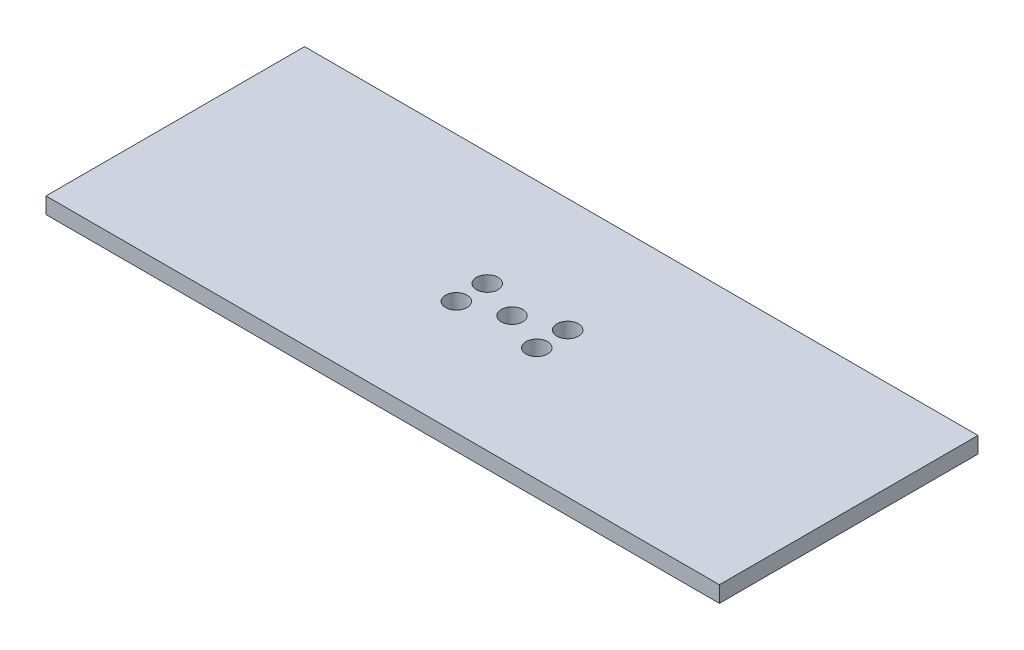
ISO-10303-21;
HEADER;
FILE_DESCRIPTION(('STEP AP214'),'2;1');
FILE_NAME('part.step','',(''),(''),'','','');
FILE_SCHEMA(('AUTOMOTIVE_DESIGN { 1 0 10303 214 1 1 1 1 }'));
ENDSEC;
DATA;
#1=APPLICATION_CONTEXT('core data for automotive mechanical design processes');
#2=APPLICATION_PROTOCOL_DEFINITION('international standard','automotive_design',2000,#1);
#3=PRODUCT_CONTEXT('',#1,'mechanical');
#4=PRODUCT('Part','Part','',(#3));
#5=PRODUCT_RELATED_PRODUCT_CATEGORY('part','',(#4));
#6=PRODUCT_DEFINITION_FORMATION('','',#4);
#7=PRODUCT_DEFINITION_CONTEXT('part definition',#1,'design');
#8=PRODUCT_DEFINITION('design','',#6,#7);
#9=PRODUCT_DEFINITION_SHAPE('','',#8);
#10=(LENGTH_UNIT() NAMED_UNIT(*) SI_UNIT(.MILLI.,.METRE.));
#11=(NAMED_UNIT(*) PLANE_ANGLE_UNIT() SI_UNIT($,.RADIAN.));
#12=(NAMED_UNIT(*) SI_UNIT($,.STERADIAN.) SOLID_ANGLE_UNIT());
#13=UNCERTAINTY_MEASURE_WITH_UNIT(LENGTH_MEASURE(1.E-05),#10,'distance_accuracy_value','');
#14=(GEOMETRIC_REPRESENTATION_CONTEXT(3) GLOBAL_UNCERTAINTY_ASSIGNED_CONTEXT((#13)) GLOBAL_UNIT_ASSIGNED_CONTEXT((#10,
#11,#12)) REPRESENTATION_CONTEXT('',''));
#15=CARTESIAN_POINT('',(0.,0.,0.));
#16=DIRECTION('',(0.,0.,1.));
#17=DIRECTION('',(1.,0.,0.));
#18=AXIS2_PLACEMENT_3D('',#15,#16,#17);
#19=CARTESIAN_POINT('',(0.,3.,0.));
#20=DIRECTION('',(0.,-1.,0.));
#21=DIRECTION('',(0.,0.,-1.));
#22=AXIS2_PLACEMENT_3D('',#19,#20,#21);
#23=PLANE('',#22);
#24=DIRECTION('',(0.,0.,-1.));
#25=VECTOR('',#24,1.);
#26=CARTESIAN_POINT('',(62.5,3.,24.));
#27=LINE('',#26,#25);
#28=CARTESIAN_POINT('',(62.5,3.,24.));
#29=VERTEX_POINT('',#28);
#30=CARTESIAN_POINT('',(62.5,3.,-24.));
#31=VERTEX_POINT('',#30);
#32=EDGE_CURVE('E92',#29,#31,#27,.T.);
#33=ORIENTED_EDGE('',*,*,#32,.T.);
#34=DIRECTION('',(-1.,0.,0.));
#35=VECTOR('',#34,1.);
#36=CARTESIAN_POINT('',(-62.5,3.,-24.));
#37=LINE('',#36,#35);
#38=CARTESIAN_POINT('',(-62.5,3.,-24.));
#39=VERTEX_POINT('',#38);
#40=EDGE_CURVE('E87',#31,#39,#37,.T.);
#41=ORIENTED_EDGE('',*,*,#40,.T.);
#42=DIRECTION('',(0.,0.,1.));
#43=VECTOR('',#42,1.);
#44=CARTESIAN_POINT('',(-62.5,3.,24.));
#45=LINE('',#44,#43);
#46=CARTESIAN_POINT('',(-62.5,3.,24.));
#47=VERTEX_POINT('',#46);
#48=EDGE_CURVE('E90',#39,#47,#45,.T.);
#49=ORIENTED_EDGE('',*,*,#48,.T.);
#50=DIRECTION('',(1.,0.,0.));
#51=VECTOR('',#50,1.);
#52=CARTESIAN_POINT('',(-62.5,3.,24.));
#53=LINE('',#52,#51);
#54=EDGE_CURVE('E57',#47,#29,#53,.T.);
#55=ORIENTED_EDGE('',*,*,#54,.T.);
#56=EDGE_LOOP('',(#33,#41,#49,#55));
#57=FACE_BOUND('',#56,.T.);
#58=CARTESIAN_POINT('',(0.,3.,0.));
#59=DIRECTION('',(0.,1.,0.));
#60=DIRECTION('',(0.,0.,1.));
#61=AXIS2_PLACEMENT_3D('',#58,#59,#60);
#62=CIRCLE('',#61,2.);
#63=CARTESIAN_POINT('',(0.,3.,2.));
#64=VERTEX_POINT('',#63);
#65=EDGE_CURVE('E112',#64,#64,#62,.T.);
#66=ORIENTED_EDGE('',*,*,#65,.F.);
#67=EDGE_LOOP('',(#66));
#68=FACE_BOUND('',#67,.T.);
#69=CARTESIAN_POINT('',(-7.4683036326853,3.,-2.86782859495116));
#70=DIRECTION('',(0.,1.,0.));
#71=DIRECTION('',(0.,0.,1.));
#72=AXIS2_PLACEMENT_3D('',#69,#70,#71);
#73=CIRCLE('',#72,2.);
#74=CARTESIAN_POINT('',(-7.4683036326853,3.,-0.867828594951156));
#75=VERTEX_POINT('',#74);
#76=EDGE_CURVE('E134',#75,#75,#73,.T.);
#77=ORIENTED_EDGE('',*,*,#76,.F.);
#78=EDGE_LOOP('',(#77));
#79=FACE_BOUND('',#78,.T.);
#80=CARTESIAN_POINT('',(7.4683036326853,3.,2.86782859495116));
#81=DIRECTION('',(0.,1.,0.));
#82=DIRECTION('',(0.,0.,1.));
#83=AXIS2_PLACEMENT_3D('',#80,#81,#82);
#84=CIRCLE('',#83,2.);
#85=CARTESIAN_POINT('',(7.4683036326853,3.,4.86782859495116));
#86=VERTEX_POINT('',#85);
#87=EDGE_CURVE('E142',#86,#86,#84,.T.);
#88=ORIENTED_EDGE('',*,*,#87,.F.);
#89=EDGE_LOOP('',(#88));
#90=FACE_BOUND('',#89,.T.);
#91=CARTESIAN_POINT('',(-7.4683036326853,3.,2.86782859495116));
#92=DIRECTION('',(0.,1.,0.));
#93=DIRECTION('',(0.,0.,1.));
#94=AXIS2_PLACEMENT_3D('',#91,#92,#93);
#95=CIRCLE('',#94,2.);
#96=CARTESIAN_POINT('',(-7.4683036326853,3.,4.86782859495116));
#97=VERTEX_POINT('',#96);
#98=EDGE_CURVE('E150',#97,#97,#95,.T.);
#99=ORIENTED_EDGE('',*,*,#98,.F.);
#100=EDGE_LOOP('',(#99));
#101=FACE_BOUND('',#100,.T.);
#102=CARTESIAN_POINT('',(7.4683036326853,3.,-2.86782859495116));
#103=DIRECTION('',(0.,1.,0.));
#104=DIRECTION('',(0.,0.,1.));
#105=AXIS2_PLACEMENT_3D('',#102,#103,#104);
#106=CIRCLE('',#105,2.);
#107=CARTESIAN_POINT('',(7.4683036326853,3.,-0.867828594951153));
#108=VERTEX_POINT('',#107);
#109=EDGE_CURVE('E158',#108,#108,#106,.T.);
#110=ORIENTED_EDGE('',*,*,#109,.F.);
#111=EDGE_LOOP('',(#110));
#112=FACE_BOUND('',#111,.T.);
#113=ADVANCED_FACE('F39',(#57,#68,#79,#90,#101,#112),#23,.F.);
#114=CARTESIAN_POINT('',(0.,0.,0.));
#115=DIRECTION('',(0.,-1.,0.));
#116=DIRECTION('',(0.,0.,-1.));
#117=AXIS2_PLACEMENT_3D('',#114,#115,#116);
#118=PLANE('',#117);
#119=CARTESIAN_POINT('',(-7.4683036326853,0.,2.86782859495116));
#120=DIRECTION('',(0.,1.,0.));
#121=DIRECTION('',(0.,0.,1.));
#122=AXIS2_PLACEMENT_3D('',#119,#120,#121);
#123=CIRCLE('',#122,2.);
#124=CARTESIAN_POINT('',(-7.4683036326853,0.,4.86782859495116));
#125=VERTEX_POINT('',#124);
#126=EDGE_CURVE('E154',#125,#125,#123,.T.);
#127=ORIENTED_EDGE('',*,*,#126,.T.);
#128=EDGE_LOOP('',(#127));
#129=FACE_BOUND('',#128,.T.);
#130=CARTESIAN_POINT('',(-7.4683036326853,0.,-2.86782859495116));
#131=DIRECTION('',(0.,1.,0.));
#132=DIRECTION('',(0.,0.,1.));
#133=AXIS2_PLACEMENT_3D('',#130,#131,#132);
#134=CIRCLE('',#133,2.);
#135=CARTESIAN_POINT('',(-7.4683036326853,0.,-0.867828594951156));
#136=VERTEX_POINT('',#135);
#137=EDGE_CURVE('E138',#136,#136,#134,.T.);
#138=ORIENTED_EDGE('',*,*,#137,.T.);
#139=EDGE_LOOP('',(#138));
#140=FACE_BOUND('',#139,.T.);
#141=DIRECTION('',(0.,0.,-1.));
#142=VECTOR('',#141,1.);
#143=CARTESIAN_POINT('',(62.5,0.,24.));
#144=LINE('',#143,#142);
#145=CARTESIAN_POINT('',(62.5,0.,24.));
#146=VERTEX_POINT('',#145);
#147=CARTESIAN_POINT('',(62.5,0.,-24.));
#148=VERTEX_POINT('',#147);
#149=EDGE_CURVE('E108',#146,#148,#144,.T.);
#150=ORIENTED_EDGE('',*,*,#149,.F.);
#151=DIRECTION('',(1.,0.,0.));
#152=VECTOR('',#151,1.);
#153=CARTESIAN_POINT('',(-62.5,0.,24.));
#154=LINE('',#153,#152);
#155=CARTESIAN_POINT('',(-62.5,0.,24.));
#156=VERTEX_POINT('',#155);
#157=EDGE_CURVE('E80',#156,#146,#154,.T.);
#158=ORIENTED_EDGE('',*,*,#157,.F.);
#159=DIRECTION('',(0.,0.,1.));
#160=VECTOR('',#159,1.);
#161=CARTESIAN_POINT('',(-62.5,0.,24.));
#162=LINE('',#161,#160);
#163=CARTESIAN_POINT('',(-62.5,0.,-24.));
#164=VERTEX_POINT('',#163);
#165=EDGE_CURVE('E74',#164,#156,#162,.T.);
#166=ORIENTED_EDGE('',*,*,#165,.F.);
#167=DIRECTION('',(-1.,0.,0.));
#168=VECTOR('',#167,1.);
#169=CARTESIAN_POINT('',(-62.5,0.,-24.));
#170=LINE('',#169,#168);
#171=EDGE_CURVE('E97',#148,#164,#170,.T.);
#172=ORIENTED_EDGE('',*,*,#171,.F.);
#173=EDGE_LOOP('',(#150,#158,#166,#172));
#174=FACE_BOUND('',#173,.T.);
#175=CARTESIAN_POINT('',(0.,0.,0.));
#176=DIRECTION('',(0.,1.,0.));
#177=DIRECTION('',(0.,0.,1.));
#178=AXIS2_PLACEMENT_3D('',#175,#176,#177);
#179=CIRCLE('',#178,2.);
#180=CARTESIAN_POINT('',(0.,0.,2.));
#181=VERTEX_POINT('',#180);
#182=EDGE_CURVE('E130',#181,#181,#179,.T.);
#183=ORIENTED_EDGE('',*,*,#182,.T.);
#184=EDGE_LOOP('',(#183));
#185=FACE_BOUND('',#184,.T.);
#186=CARTESIAN_POINT('',(7.4683036326853,0.,2.86782859495116));
#187=DIRECTION('',(0.,1.,0.));
#188=DIRECTION('',(0.,0.,1.));
#189=AXIS2_PLACEMENT_3D('',#186,#187,#188);
#190=CIRCLE('',#189,2.);
#191=CARTESIAN_POINT('',(7.4683036326853,0.,4.86782859495116));
#192=VERTEX_POINT('',#191);
#193=EDGE_CURVE('E146',#192,#192,#190,.T.);
#194=ORIENTED_EDGE('',*,*,#193,.T.);
#195=EDGE_LOOP('',(#194));
#196=FACE_BOUND('',#195,.T.);
#197=CARTESIAN_POINT('',(7.4683036326853,0.,-2.86782859495116));
#198=DIRECTION('',(0.,1.,0.));
#199=DIRECTION('',(0.,0.,1.));
#200=AXIS2_PLACEMENT_3D('',#197,#198,#199);
#201=CIRCLE('',#200,2.);
#202=CARTESIAN_POINT('',(7.4683036326853,0.,-0.867828594951153));
#203=VERTEX_POINT('',#202);
#204=EDGE_CURVE('E162',#203,#203,#201,.T.);
#205=ORIENTED_EDGE('',*,*,#204,.T.);
#206=EDGE_LOOP('',(#205));
#207=FACE_BOUND('',#206,.T.);
#208=ADVANCED_FACE('F125',(#129,#140,#174,#185,#196,#207),#118,.T.);
#209=CARTESIAN_POINT('',(62.5,3.,24.));
#210=DIRECTION('',(-1.,0.,0.));
#211=DIRECTION('',(0.,0.,1.));
#212=AXIS2_PLACEMENT_3D('',#209,#210,#211);
#213=PLANE('',#212);
#214=ORIENTED_EDGE('',*,*,#149,.T.);
#215=DIRECTION('',(0.,-1.,0.));
#216=VECTOR('',#215,1.);
#217=CARTESIAN_POINT('',(62.5,3.,-24.));
#218=LINE('',#217,#216);
#219=EDGE_CURVE('E11',#31,#148,#218,.T.);
#220=ORIENTED_EDGE('',*,*,#219,.F.);
#221=ORIENTED_EDGE('',*,*,#32,.F.);
#222=DIRECTION('',(0.,-1.,0.));
#223=VECTOR('',#222,1.);
#224=CARTESIAN_POINT('',(62.5,3.,24.));
#225=LINE('',#224,#223);
#226=EDGE_CURVE('E104',#29,#146,#225,.T.);
#227=ORIENTED_EDGE('',*,*,#226,.T.);
#228=EDGE_LOOP('',(#214,#220,#221,#227));
#229=FACE_BOUND('',#228,.T.);
#230=ADVANCED_FACE('F41',(#229),#213,.F.);
#231=CARTESIAN_POINT('',(-62.5,3.,-24.));
#232=DIRECTION('',(0.,0.,1.));
#233=DIRECTION('',(1.,0.,0.));
#234=AXIS2_PLACEMENT_3D('',#231,#232,#233);
#235=PLANE('',#234);
#236=ORIENTED_EDGE('',*,*,#171,.T.);
#237=DIRECTION('',(0.,-1.,0.));
#238=VECTOR('',#237,1.);
#239=CARTESIAN_POINT('',(-62.5,3.,-24.));
#240=LINE('',#239,#238);
#241=EDGE_CURVE('E49',#39,#164,#240,.T.);
#242=ORIENTED_EDGE('',*,*,#241,.F.);
#243=ORIENTED_EDGE('',*,*,#40,.F.);
#244=ORIENTED_EDGE('',*,*,#219,.T.);
#245=EDGE_LOOP('',(#236,#242,#243,#244));
#246=FACE_BOUND('',#245,.T.);
#247=ADVANCED_FACE('F96',(#246),#235,.F.);
#248=CARTESIAN_POINT('',(-62.5,3.,24.));
#249=DIRECTION('',(1.,0.,0.));
#250=DIRECTION('',(0.,0.,-1.));
#251=AXIS2_PLACEMENT_3D('',#248,#249,#250);
#252=PLANE('',#251);
#253=ORIENTED_EDGE('',*,*,#165,.T.);
#254=DIRECTION('',(0.,-1.,0.));
#255=VECTOR('',#254,1.);
#256=CARTESIAN_POINT('',(-62.5,3.,24.));
#257=LINE('',#256,#255);
#258=EDGE_CURVE('E99',#47,#156,#257,.T.);
#259=ORIENTED_EDGE('',*,*,#258,.F.);
#260=ORIENTED_EDGE('',*,*,#48,.F.);
#261=ORIENTED_EDGE('',*,*,#241,.T.);
#262=EDGE_LOOP('',(#253,#259,#260,#261));
#263=FACE_BOUND('',#262,.T.);
#264=ADVANCED_FACE('F100',(#263),#252,.F.);
#265=CARTESIAN_POINT('',(-62.5,3.,24.));
#266=DIRECTION('',(0.,0.,-1.));
#267=DIRECTION('',(-1.,0.,0.));
#268=AXIS2_PLACEMENT_3D('',#265,#266,#267);
#269=PLANE('',#268);
#270=ORIENTED_EDGE('',*,*,#157,.T.);
#271=ORIENTED_EDGE('',*,*,#226,.F.);
#272=ORIENTED_EDGE('',*,*,#54,.F.);
#273=ORIENTED_EDGE('',*,*,#258,.T.);
#274=EDGE_LOOP('',(#270,#271,#272,#273));
#275=FACE_BOUND('',#274,.T.);
#276=ADVANCED_FACE('F122',(#275),#269,.F.);
#277=CARTESIAN_POINT('',(0.,3.,0.));
#278=DIRECTION('',(0.,-1.,0.));
#279=DIRECTION('',(0.,0.,-1.));
#280=AXIS2_PLACEMENT_3D('',#277,#278,#279);
#281=CYLINDRICAL_SURFACE('',#280,2.);
#282=ORIENTED_EDGE('',*,*,#65,.T.);
#283=EDGE_LOOP('',(#282));
#284=FACE_BOUND('',#283,.T.);
#285=ORIENTED_EDGE('',*,*,#182,.F.);
#286=EDGE_LOOP('',(#285));
#287=FACE_BOUND('',#286,.T.);
#288=ADVANCED_FACE('F181',(#284,#287),#281,.F.);
#289=CARTESIAN_POINT('',(-7.4683036326853,3.,-2.86782859495116));
#290=DIRECTION('',(0.,-1.,0.));
#291=DIRECTION('',(0.,0.,-1.));
#292=AXIS2_PLACEMENT_3D('',#289,#290,#291);
#293=CYLINDRICAL_SURFACE('',#292,2.);
#294=ORIENTED_EDGE('',*,*,#76,.T.);
#295=EDGE_LOOP('',(#294));
#296=FACE_BOUND('',#295,.T.);
#297=ORIENTED_EDGE('',*,*,#137,.F.);
#298=EDGE_LOOP('',(#297));
#299=FACE_BOUND('',#298,.T.);
#300=ADVANCED_FACE('F227',(#296,#299),#293,.F.);
#301=CARTESIAN_POINT('',(7.4683036326853,3.,2.86782859495116));
#302=DIRECTION('',(0.,-1.,0.));
#303=DIRECTION('',(0.,0.,-1.));
#304=AXIS2_PLACEMENT_3D('',#301,#302,#303);
#305=CYLINDRICAL_SURFACE('',#304,2.);
#306=ORIENTED_EDGE('',*,*,#87,.T.);
#307=EDGE_LOOP('',(#306));
#308=FACE_BOUND('',#307,.T.);
#309=ORIENTED_EDGE('',*,*,#193,.F.);
#310=EDGE_LOOP('',(#309));
#311=FACE_BOUND('',#310,.T.);
#312=ADVANCED_FACE('F235',(#308,#311),#305,.F.);
#313=CARTESIAN_POINT('',(-7.4683036326853,3.,2.86782859495116));
#314=DIRECTION('',(0.,-1.,0.));
#315=DIRECTION('',(0.,0.,-1.));
#316=AXIS2_PLACEMENT_3D('',#313,#314,#315);
#317=CYLINDRICAL_SURFACE('',#316,2.);
#318=ORIENTED_EDGE('',*,*,#98,.T.);
#319=EDGE_LOOP('',(#318));
#320=FACE_BOUND('',#319,.T.);
#321=ORIENTED_EDGE('',*,*,#126,.F.);
#322=EDGE_LOOP('',(#321));
#323=FACE_BOUND('',#322,.T.);
#324=ADVANCED_FACE('F243',(#320,#323),#317,.F.);
#325=CARTESIAN_POINT('',(7.4683036326853,3.,-2.86782859495116));
#326=DIRECTION('',(0.,-1.,0.));
#327=DIRECTION('',(0.,0.,-1.));
#328=AXIS2_PLACEMENT_3D('',#325,#326,#327);
#329=CYLINDRICAL_SURFACE('',#328,2.);
#330=ORIENTED_EDGE('',*,*,#109,.T.);
#331=EDGE_LOOP('',(#330));
#332=FACE_BOUND('',#331,.T.);
#333=ORIENTED_EDGE('',*,*,#204,.F.);
#334=EDGE_LOOP('',(#333));
#335=FACE_BOUND('',#334,.T.);
#336=ADVANCED_FACE('F170',(#332,#335),#329,.F.);
#337=CLOSED_SHELL('',(#113,#208,#230,#247,#264,#276,#288,#300,#312,#324,#336));
#338=MANIFOLD_SOLID_BREP('B2',#337);
#339=ADVANCED_BREP_SHAPE_REPRESENTATION('',(#18,#338),#14);
#340=SHAPE_DEFINITION_REPRESENTATION(#9,#339);
ENDSEC;
END-ISO-10303-21;
